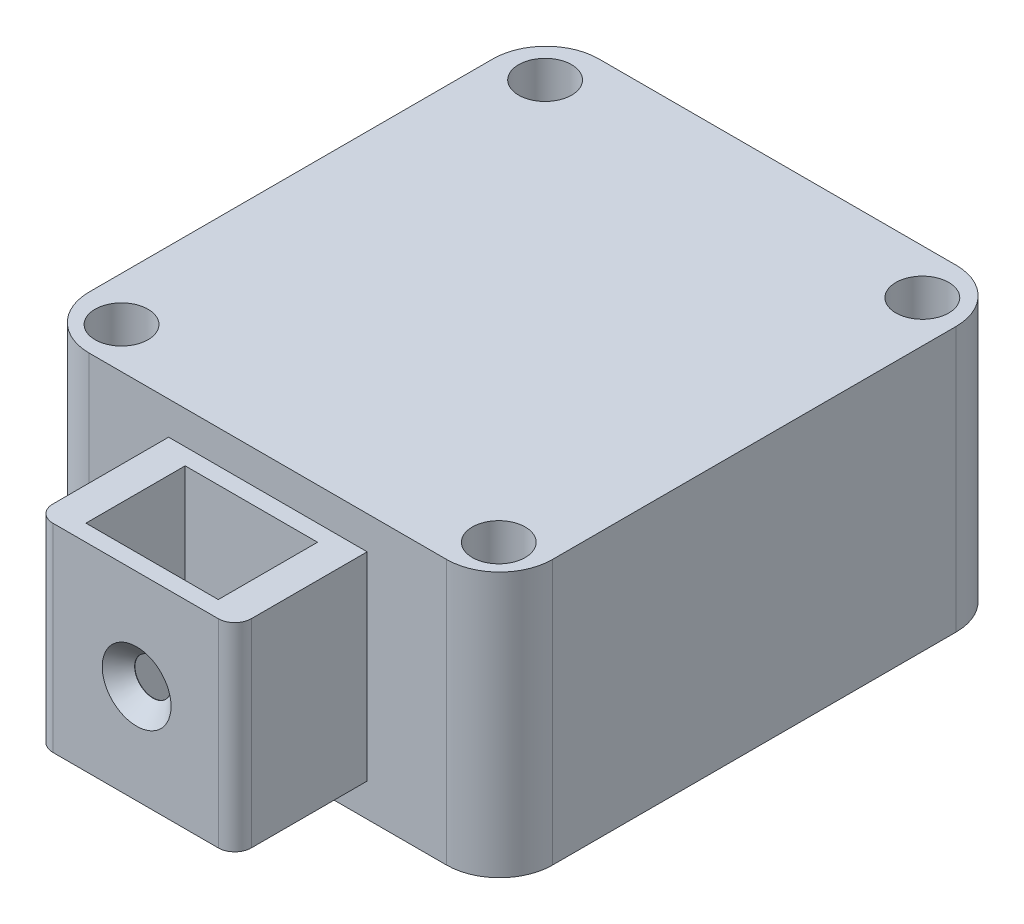
ISO-10303-21;
HEADER;
FILE_DESCRIPTION(('STEP AP214'),'2;1');
FILE_NAME('part.step','',(''),(''),'','','');
FILE_SCHEMA(('AUTOMOTIVE_DESIGN { 1 0 10303 214 1 1 1 1 }'));
ENDSEC;
DATA;
#1=APPLICATION_CONTEXT('core data for automotive mechanical design processes');
#2=APPLICATION_PROTOCOL_DEFINITION('international standard','automotive_design',2000,#1);
#3=PRODUCT_CONTEXT('',#1,'mechanical');
#4=PRODUCT('Part','Part','',(#3));
#5=PRODUCT_RELATED_PRODUCT_CATEGORY('part','',(#4));
#6=PRODUCT_DEFINITION_FORMATION('','',#4);
#7=PRODUCT_DEFINITION_CONTEXT('part definition',#1,'design');
#8=PRODUCT_DEFINITION('design','',#6,#7);
#9=PRODUCT_DEFINITION_SHAPE('','',#8);
#10=(LENGTH_UNIT() NAMED_UNIT(*) SI_UNIT(.MILLI.,.METRE.));
#11=(NAMED_UNIT(*) PLANE_ANGLE_UNIT() SI_UNIT($,.RADIAN.));
#12=(NAMED_UNIT(*) SI_UNIT($,.STERADIAN.) SOLID_ANGLE_UNIT());
#13=UNCERTAINTY_MEASURE_WITH_UNIT(LENGTH_MEASURE(1.E-05),#10,'distance_accuracy_value','');
#14=(GEOMETRIC_REPRESENTATION_CONTEXT(3) GLOBAL_UNCERTAINTY_ASSIGNED_CONTEXT((#13)) GLOBAL_UNIT_ASSIGNED_CONTEXT((#10,
#11,#12)) REPRESENTATION_CONTEXT('',''));
#15=CARTESIAN_POINT('',(0.,0.,0.));
#16=DIRECTION('',(0.,0.,1.));
#17=DIRECTION('',(1.,0.,0.));
#18=AXIS2_PLACEMENT_3D('',#15,#16,#17);
#19=CARTESIAN_POINT('',(-35.1933701657459,40.,38.1906077348066));
#20=DIRECTION('',(0.,0.,-1.));
#21=DIRECTION('',(-1.,0.,0.));
#22=AXIS2_PLACEMENT_3D('',#19,#20,#21);
#23=PLANE('',#22);
#24=DIRECTION('',(1.,0.,0.));
#25=VECTOR('',#24,1.);
#26=CARTESIAN_POINT('',(-35.1933701657459,0.,38.1906077348066));
#27=LINE('',#26,#25);
#28=CARTESIAN_POINT('',(-27.1933701657459,0.,38.1906077348066));
#29=VERTEX_POINT('',#28);
#30=CARTESIAN_POINT('',(26.8066298342541,0.,38.1906077348066));
#31=VERTEX_POINT('',#30);
#32=EDGE_CURVE('E268',#29,#31,#27,.T.);
#33=ORIENTED_EDGE('',*,*,#32,.T.);
#34=DIRECTION('',(0.,-1.,0.));
#35=VECTOR('',#34,1.);
#36=CARTESIAN_POINT('',(26.8066298342541,40.,38.1906077348066));
#37=LINE('',#36,#35);
#38=CARTESIAN_POINT('',(26.8066298342541,40.,38.1906077348066));
#39=VERTEX_POINT('',#38);
#40=EDGE_CURVE('E303',#31,#39,#37,.F.);
#41=ORIENTED_EDGE('',*,*,#40,.T.);
#42=DIRECTION('',(1.,0.,0.));
#43=VECTOR('',#42,1.);
#44=CARTESIAN_POINT('',(-35.1933701657459,40.,38.1906077348066));
#45=LINE('',#44,#43);
#46=CARTESIAN_POINT('',(-27.1933701657459,40.,38.1906077348066));
#47=VERTEX_POINT('',#46);
#48=EDGE_CURVE('E274',#47,#39,#45,.T.);
#49=ORIENTED_EDGE('',*,*,#48,.F.);
#50=DIRECTION('',(0.,-1.,0.));
#51=VECTOR('',#50,1.);
#52=CARTESIAN_POINT('',(-27.1933701657459,40.,38.1906077348066));
#53=LINE('',#52,#51);
#54=EDGE_CURVE('E300',#47,#29,#53,.T.);
#55=ORIENTED_EDGE('',*,*,#54,.T.);
#56=EDGE_LOOP('',(#33,#41,#49,#55));
#57=FACE_BOUND('',#56,.T.);
#58=DIRECTION('',(0.,-1.,0.));
#59=VECTOR('',#58,1.);
#60=CARTESIAN_POINT('',(-15.1933701657459,35.,38.1906077348066));
#61=LINE('',#60,#59);
#62=CARTESIAN_POINT('',(-15.1933701657459,35.,38.1906077348066));
#63=VERTEX_POINT('',#62);
#64=CARTESIAN_POINT('',(-15.1933701657459,5.,38.1906077348066));
#65=VERTEX_POINT('',#64);
#66=EDGE_CURVE('E207',#63,#65,#61,.T.);
#67=ORIENTED_EDGE('',*,*,#66,.F.);
#68=DIRECTION('',(-1.,0.,0.));
#69=VECTOR('',#68,1.);
#70=CARTESIAN_POINT('',(-15.1933701657459,35.,38.1906077348066));
#71=LINE('',#70,#69);
#72=CARTESIAN_POINT('',(14.8066298342541,35.,38.1906077348066));
#73=VERTEX_POINT('',#72);
#74=EDGE_CURVE('E218',#73,#63,#71,.T.);
#75=ORIENTED_EDGE('',*,*,#74,.F.);
#76=DIRECTION('',(0.,1.,0.));
#77=VECTOR('',#76,1.);
#78=CARTESIAN_POINT('',(14.8066298342541,35.,38.1906077348066));
#79=LINE('',#78,#77);
#80=CARTESIAN_POINT('',(14.8066298342541,5.,38.1906077348066));
#81=VERTEX_POINT('',#80);
#82=EDGE_CURVE('E227',#81,#73,#79,.T.);
#83=ORIENTED_EDGE('',*,*,#82,.F.);
#84=DIRECTION('',(1.,0.,0.));
#85=VECTOR('',#84,1.);
#86=CARTESIAN_POINT('',(-15.1933701657459,5.,38.1906077348066));
#87=LINE('',#86,#85);
#88=EDGE_CURVE('E224',#65,#81,#87,.T.);
#89=ORIENTED_EDGE('',*,*,#88,.F.);
#90=EDGE_LOOP('',(#67,#75,#83,#89));
#91=FACE_BOUND('',#90,.T.);
#92=ADVANCED_FACE('F32',(#57,#91),#23,.F.);
#93=CARTESIAN_POINT('',(34.8066298342541,40.,-38.8093922651934));
#94=DIRECTION('',(-1.,0.,0.));
#95=DIRECTION('',(0.,0.,1.));
#96=AXIS2_PLACEMENT_3D('',#93,#94,#95);
#97=PLANE('',#96);
#98=DIRECTION('',(0.,0.,-1.));
#99=VECTOR('',#98,1.);
#100=CARTESIAN_POINT('',(34.8066298342541,40.,-38.8093922651934));
#101=LINE('',#100,#99);
#102=CARTESIAN_POINT('',(34.8066298342541,40.,30.1906077348066));
#103=VERTEX_POINT('',#102);
#104=CARTESIAN_POINT('',(34.8066298342541,40.,-30.8093922651934));
#105=VERTEX_POINT('',#104);
#106=EDGE_CURVE('E264',#103,#105,#101,.T.);
#107=ORIENTED_EDGE('',*,*,#106,.F.);
#108=DIRECTION('',(0.,-1.,0.));
#109=VECTOR('',#108,1.);
#110=CARTESIAN_POINT('',(34.8066298342541,40.,30.1906077348066));
#111=LINE('',#110,#109);
#112=CARTESIAN_POINT('',(34.8066298342541,0.,30.1906077348066));
#113=VERTEX_POINT('',#112);
#114=EDGE_CURVE('E289',#103,#113,#111,.T.);
#115=ORIENTED_EDGE('',*,*,#114,.T.);
#116=DIRECTION('',(0.,0.,-1.));
#117=VECTOR('',#116,1.);
#118=CARTESIAN_POINT('',(34.8066298342541,0.,-38.8093922651934));
#119=LINE('',#118,#117);
#120=CARTESIAN_POINT('',(34.8066298342541,0.,-30.8093922651934));
#121=VERTEX_POINT('',#120);
#122=EDGE_CURVE('E261',#113,#121,#119,.T.);
#123=ORIENTED_EDGE('',*,*,#122,.T.);
#124=DIRECTION('',(0.,-1.,0.));
#125=VECTOR('',#124,1.);
#126=CARTESIAN_POINT('',(34.8066298342541,40.,-30.8093922651934));
#127=LINE('',#126,#125);
#128=EDGE_CURVE('E277',#121,#105,#127,.F.);
#129=ORIENTED_EDGE('',*,*,#128,.T.);
#130=EDGE_LOOP('',(#107,#115,#123,#129));
#131=FACE_BOUND('',#130,.T.);
#132=ADVANCED_FACE('F363',(#131),#97,.F.);
#133=CARTESIAN_POINT('',(-35.1933701657459,40.,-38.8093922651934));
#134=DIRECTION('',(0.,0.,1.));
#135=DIRECTION('',(1.,0.,0.));
#136=AXIS2_PLACEMENT_3D('',#133,#134,#135);
#137=PLANE('',#136);
#138=DIRECTION('',(-1.,0.,0.));
#139=VECTOR('',#138,1.);
#140=CARTESIAN_POINT('',(-35.1933701657459,40.,-38.8093922651934));
#141=LINE('',#140,#139);
#142=CARTESIAN_POINT('',(26.8066298342541,40.,-38.8093922651934));
#143=VERTEX_POINT('',#142);
#144=CARTESIAN_POINT('',(-27.1933701657459,40.,-38.8093922651934));
#145=VERTEX_POINT('',#144);
#146=EDGE_CURVE('E267',#143,#145,#141,.T.);
#147=ORIENTED_EDGE('',*,*,#146,.F.);
#148=DIRECTION('',(0.,-1.,0.));
#149=VECTOR('',#148,1.);
#150=CARTESIAN_POINT('',(26.8066298342541,40.,-38.8093922651934));
#151=LINE('',#150,#149);
#152=CARTESIAN_POINT('',(26.8066298342541,0.,-38.8093922651934));
#153=VERTEX_POINT('',#152);
#154=EDGE_CURVE('E315',#143,#153,#151,.T.);
#155=ORIENTED_EDGE('',*,*,#154,.T.);
#156=DIRECTION('',(-1.,0.,0.));
#157=VECTOR('',#156,1.);
#158=CARTESIAN_POINT('',(-35.1933701657459,0.,-38.8093922651934));
#159=LINE('',#158,#157);
#160=CARTESIAN_POINT('',(-27.1933701657459,0.,-38.8093922651934));
#161=VERTEX_POINT('',#160);
#162=EDGE_CURVE('E280',#153,#161,#159,.T.);
#163=ORIENTED_EDGE('',*,*,#162,.T.);
#164=DIRECTION('',(0.,-1.,0.));
#165=VECTOR('',#164,1.);
#166=CARTESIAN_POINT('',(-27.1933701657459,40.,-38.8093922651934));
#167=LINE('',#166,#165);
#168=EDGE_CURVE('E313',#161,#145,#167,.F.);
#169=ORIENTED_EDGE('',*,*,#168,.T.);
#170=EDGE_LOOP('',(#147,#155,#163,#169));
#171=FACE_BOUND('',#170,.T.);
#172=ADVANCED_FACE('F369',(#171),#137,.F.);
#173=CARTESIAN_POINT('',(-35.1933701657459,40.,-38.8093922651934));
#174=DIRECTION('',(1.,0.,0.));
#175=DIRECTION('',(0.,0.,-1.));
#176=AXIS2_PLACEMENT_3D('',#173,#174,#175);
#177=PLANE('',#176);
#178=DIRECTION('',(0.,0.,1.));
#179=VECTOR('',#178,1.);
#180=CARTESIAN_POINT('',(-35.1933701657459,40.,-38.8093922651934));
#181=LINE('',#180,#179);
#182=CARTESIAN_POINT('',(-35.1933701657459,40.,-30.8093922651934));
#183=VERTEX_POINT('',#182);
#184=CARTESIAN_POINT('',(-35.1933701657459,40.,30.1906077348066));
#185=VERTEX_POINT('',#184);
#186=EDGE_CURVE('E271',#183,#185,#181,.T.);
#187=ORIENTED_EDGE('',*,*,#186,.F.);
#188=DIRECTION('',(0.,-1.,0.));
#189=VECTOR('',#188,1.);
#190=CARTESIAN_POINT('',(-35.1933701657459,40.,-30.8093922651934));
#191=LINE('',#190,#189);
#192=CARTESIAN_POINT('',(-35.1933701657459,0.,-30.8093922651934));
#193=VERTEX_POINT('',#192);
#194=EDGE_CURVE('E320',#183,#193,#191,.T.);
#195=ORIENTED_EDGE('',*,*,#194,.T.);
#196=DIRECTION('',(0.,0.,1.));
#197=VECTOR('',#196,1.);
#198=CARTESIAN_POINT('',(-35.1933701657459,0.,-38.8093922651934));
#199=LINE('',#198,#197);
#200=CARTESIAN_POINT('',(-35.1933701657459,0.,30.1906077348066));
#201=VERTEX_POINT('',#200);
#202=EDGE_CURVE('E283',#193,#201,#199,.T.);
#203=ORIENTED_EDGE('',*,*,#202,.T.);
#204=DIRECTION('',(0.,-1.,0.));
#205=VECTOR('',#204,1.);
#206=CARTESIAN_POINT('',(-35.1933701657459,40.,30.1906077348066));
#207=LINE('',#206,#205);
#208=EDGE_CURVE('E318',#201,#185,#207,.F.);
#209=ORIENTED_EDGE('',*,*,#208,.T.);
#210=EDGE_LOOP('',(#187,#195,#203,#209));
#211=FACE_BOUND('',#210,.T.);
#212=ADVANCED_FACE('F376',(#211),#177,.F.);
#213=CARTESIAN_POINT('',(0.,40.,0.));
#214=DIRECTION('',(0.,1.,0.));
#215=DIRECTION('',(0.,0.,1.));
#216=AXIS2_PLACEMENT_3D('',#213,#214,#215);
#217=PLANE('',#216);
#218=CARTESIAN_POINT('',(-28.5,40.,-32.));
#219=DIRECTION('',(0.,1.,0.));
#220=DIRECTION('',(0.,0.,1.));
#221=AXIS2_PLACEMENT_3D('',#218,#219,#220);
#222=CIRCLE('',#221,4.);
#223=CARTESIAN_POINT('',(-28.5,40.,-28.));
#224=VERTEX_POINT('',#223);
#225=EDGE_CURVE('E239',#224,#224,#222,.T.);
#226=ORIENTED_EDGE('',*,*,#225,.F.);
#227=EDGE_LOOP('',(#226));
#228=FACE_BOUND('',#227,.T.);
#229=CARTESIAN_POINT('',(28.5,40.,-32.));
#230=DIRECTION('',(0.,1.,0.));
#231=DIRECTION('',(0.,0.,1.));
#232=AXIS2_PLACEMENT_3D('',#229,#230,#231);
#233=CIRCLE('',#232,4.00000000000001);
#234=CARTESIAN_POINT('',(28.5,40.,-28.));
#235=VERTEX_POINT('',#234);
#236=EDGE_CURVE('E250',#235,#235,#233,.T.);
#237=ORIENTED_EDGE('',*,*,#236,.F.);
#238=EDGE_LOOP('',(#237));
#239=FACE_BOUND('',#238,.T.);
#240=CARTESIAN_POINT('',(28.5,40.,32.));
#241=DIRECTION('',(0.,1.,0.));
#242=DIRECTION('',(0.,0.,1.));
#243=AXIS2_PLACEMENT_3D('',#240,#241,#242);
#244=CIRCLE('',#243,4.);
#245=CARTESIAN_POINT('',(28.5,40.,36.));
#246=VERTEX_POINT('',#245);
#247=EDGE_CURVE('E244',#246,#246,#244,.T.);
#248=ORIENTED_EDGE('',*,*,#247,.F.);
#249=EDGE_LOOP('',(#248));
#250=FACE_BOUND('',#249,.T.);
#251=CARTESIAN_POINT('',(-28.5,40.,32.));
#252=DIRECTION('',(0.,1.,0.));
#253=DIRECTION('',(0.,0.,1.));
#254=AXIS2_PLACEMENT_3D('',#251,#252,#253);
#255=CIRCLE('',#254,4.00000000000001);
#256=CARTESIAN_POINT('',(-28.5,40.,36.));
#257=VERTEX_POINT('',#256);
#258=EDGE_CURVE('E243',#257,#257,#255,.T.);
#259=ORIENTED_EDGE('',*,*,#258,.F.);
#260=EDGE_LOOP('',(#259));
#261=FACE_BOUND('',#260,.T.);
#262=ORIENTED_EDGE('',*,*,#48,.T.);
#263=CARTESIAN_POINT('',(26.8066298342541,40.,30.1906077348066));
#264=DIRECTION('',(0.,1.,0.));
#265=DIRECTION('',(0.,0.,1.));
#266=AXIS2_PLACEMENT_3D('',#263,#264,#265);
#267=CIRCLE('',#266,8.);
#268=EDGE_CURVE('E311',#39,#103,#267,.T.);
#269=ORIENTED_EDGE('',*,*,#268,.T.);
#270=ORIENTED_EDGE('',*,*,#106,.T.);
#271=CARTESIAN_POINT('',(26.8066298342541,40.,-30.8093922651934));
#272=DIRECTION('',(0.,1.,0.));
#273=DIRECTION('',(0.,0.,1.));
#274=AXIS2_PLACEMENT_3D('',#271,#272,#273);
#275=CIRCLE('',#274,8.);
#276=EDGE_CURVE('E309',#105,#143,#275,.T.);
#277=ORIENTED_EDGE('',*,*,#276,.T.);
#278=ORIENTED_EDGE('',*,*,#146,.T.);
#279=CARTESIAN_POINT('',(-27.1933701657459,40.,-30.8093922651934));
#280=DIRECTION('',(0.,1.,0.));
#281=DIRECTION('',(0.,0.,1.));
#282=AXIS2_PLACEMENT_3D('',#279,#280,#281);
#283=CIRCLE('',#282,8.);
#284=EDGE_CURVE('E307',#145,#183,#283,.T.);
#285=ORIENTED_EDGE('',*,*,#284,.T.);
#286=ORIENTED_EDGE('',*,*,#186,.T.);
#287=CARTESIAN_POINT('',(-27.1933701657459,40.,30.1906077348066));
#288=DIRECTION('',(0.,1.,0.));
#289=DIRECTION('',(0.,0.,1.));
#290=AXIS2_PLACEMENT_3D('',#287,#288,#289);
#291=CIRCLE('',#290,8.);
#292=EDGE_CURVE('E305',#185,#47,#291,.T.);
#293=ORIENTED_EDGE('',*,*,#292,.T.);
#294=EDGE_LOOP('',(#262,#269,#270,#277,#278,#285,#286,#293));
#295=FACE_BOUND('',#294,.T.);
#296=ADVANCED_FACE('F379',(#228,#239,#250,#261,#295),#217,.T.);
#297=CARTESIAN_POINT('',(0.,0.,0.));
#298=DIRECTION('',(0.,1.,0.));
#299=DIRECTION('',(0.,0.,1.));
#300=AXIS2_PLACEMENT_3D('',#297,#298,#299);
#301=PLANE('',#300);
#302=ORIENTED_EDGE('',*,*,#122,.F.);
#303=CARTESIAN_POINT('',(26.8066298342541,0.,30.1906077348066));
#304=DIRECTION('',(0.,1.,0.));
#305=DIRECTION('',(0.,0.,1.));
#306=AXIS2_PLACEMENT_3D('',#303,#304,#305);
#307=CIRCLE('',#306,8.);
#308=EDGE_CURVE('E298',#113,#31,#307,.F.);
#309=ORIENTED_EDGE('',*,*,#308,.T.);
#310=ORIENTED_EDGE('',*,*,#32,.F.);
#311=CARTESIAN_POINT('',(-27.1933701657459,0.,30.1906077348066));
#312=DIRECTION('',(0.,1.,0.));
#313=DIRECTION('',(0.,0.,1.));
#314=AXIS2_PLACEMENT_3D('',#311,#312,#313);
#315=CIRCLE('',#314,8.);
#316=EDGE_CURVE('E292',#29,#201,#315,.F.);
#317=ORIENTED_EDGE('',*,*,#316,.T.);
#318=ORIENTED_EDGE('',*,*,#202,.F.);
#319=CARTESIAN_POINT('',(-27.1933701657459,0.,-30.8093922651934));
#320=DIRECTION('',(0.,1.,0.));
#321=DIRECTION('',(0.,0.,1.));
#322=AXIS2_PLACEMENT_3D('',#319,#320,#321);
#323=CIRCLE('',#322,8.);
#324=EDGE_CURVE('E294',#193,#161,#323,.F.);
#325=ORIENTED_EDGE('',*,*,#324,.T.);
#326=ORIENTED_EDGE('',*,*,#162,.F.);
#327=CARTESIAN_POINT('',(26.8066298342541,0.,-30.8093922651934));
#328=DIRECTION('',(0.,1.,0.));
#329=DIRECTION('',(0.,0.,1.));
#330=AXIS2_PLACEMENT_3D('',#327,#328,#329);
#331=CIRCLE('',#330,8.);
#332=EDGE_CURVE('E296',#153,#121,#331,.F.);
#333=ORIENTED_EDGE('',*,*,#332,.T.);
#334=EDGE_LOOP('',(#302,#309,#310,#317,#318,#325,#326,#333));
#335=FACE_BOUND('',#334,.T.);
#336=ADVANCED_FACE('F374',(#335),#301,.F.);
#337=CARTESIAN_POINT('',(-28.5,10.,32.));
#338=DIRECTION('',(0.,1.,0.));
#339=DIRECTION('',(0.,0.,1.));
#340=AXIS2_PLACEMENT_3D('',#337,#338,#339);
#341=CYLINDRICAL_SURFACE('',#340,4.00000000000001);
#342=CARTESIAN_POINT('',(-28.5,10.,32.));
#343=DIRECTION('',(0.,1.,0.));
#344=DIRECTION('',(0.,0.,1.));
#345=AXIS2_PLACEMENT_3D('',#342,#343,#344);
#346=CIRCLE('',#345,4.00000000000001);
#347=CARTESIAN_POINT('',(-28.5,10.,36.));
#348=VERTEX_POINT('',#347);
#349=EDGE_CURVE('E258',#348,#348,#346,.T.);
#350=ORIENTED_EDGE('',*,*,#349,.F.);
#351=EDGE_LOOP('',(#350));
#352=FACE_BOUND('',#351,.T.);
#353=ORIENTED_EDGE('',*,*,#258,.T.);
#354=EDGE_LOOP('',(#353));
#355=FACE_BOUND('',#354,.T.);
#356=ADVANCED_FACE('F422',(#352,#355),#341,.F.);
#357=CARTESIAN_POINT('',(0.,10.,0.));
#358=DIRECTION('',(0.,1.,0.));
#359=DIRECTION('',(0.,0.,1.));
#360=AXIS2_PLACEMENT_3D('',#357,#358,#359);
#361=PLANE('',#360);
#362=ORIENTED_EDGE('',*,*,#349,.T.);
#363=EDGE_LOOP('',(#362));
#364=FACE_BOUND('',#363,.T.);
#365=ADVANCED_FACE('F427',(#364),#361,.T.);
#366=CARTESIAN_POINT('',(28.5,10.,32.));
#367=DIRECTION('',(0.,1.,0.));
#368=DIRECTION('',(0.,0.,1.));
#369=AXIS2_PLACEMENT_3D('',#366,#367,#368);
#370=CYLINDRICAL_SURFACE('',#369,4.);
#371=CARTESIAN_POINT('',(28.5,10.,32.));
#372=DIRECTION('',(0.,1.,0.));
#373=DIRECTION('',(0.,0.,1.));
#374=AXIS2_PLACEMENT_3D('',#371,#372,#373);
#375=CIRCLE('',#374,4.);
#376=CARTESIAN_POINT('',(28.5,10.,36.));
#377=VERTEX_POINT('',#376);
#378=EDGE_CURVE('E240',#377,#377,#375,.T.);
#379=ORIENTED_EDGE('',*,*,#378,.F.);
#380=EDGE_LOOP('',(#379));
#381=FACE_BOUND('',#380,.T.);
#382=ORIENTED_EDGE('',*,*,#247,.T.);
#383=EDGE_LOOP('',(#382));
#384=FACE_BOUND('',#383,.T.);
#385=ADVANCED_FACE('F438',(#381,#384),#370,.F.);
#386=CARTESIAN_POINT('',(0.,10.,0.));
#387=DIRECTION('',(0.,1.,0.));
#388=DIRECTION('',(0.,0.,1.));
#389=AXIS2_PLACEMENT_3D('',#386,#387,#388);
#390=PLANE('',#389);
#391=ORIENTED_EDGE('',*,*,#378,.T.);
#392=EDGE_LOOP('',(#391));
#393=FACE_BOUND('',#392,.T.);
#394=ADVANCED_FACE('F452',(#393),#390,.T.);
#395=CARTESIAN_POINT('',(28.5,10.,-32.));
#396=DIRECTION('',(0.,1.,0.));
#397=DIRECTION('',(0.,0.,1.));
#398=AXIS2_PLACEMENT_3D('',#395,#396,#397);
#399=CYLINDRICAL_SURFACE('',#398,4.00000000000001);
#400=CARTESIAN_POINT('',(28.5,10.,-32.));
#401=DIRECTION('',(0.,1.,0.));
#402=DIRECTION('',(0.,0.,1.));
#403=AXIS2_PLACEMENT_3D('',#400,#401,#402);
#404=CIRCLE('',#403,4.00000000000001);
#405=CARTESIAN_POINT('',(28.5,10.,-28.));
#406=VERTEX_POINT('',#405);
#407=EDGE_CURVE('E247',#406,#406,#404,.T.);
#408=ORIENTED_EDGE('',*,*,#407,.F.);
#409=EDGE_LOOP('',(#408));
#410=FACE_BOUND('',#409,.T.);
#411=ORIENTED_EDGE('',*,*,#236,.T.);
#412=EDGE_LOOP('',(#411));
#413=FACE_BOUND('',#412,.T.);
#414=ADVANCED_FACE('F449',(#410,#413),#399,.F.);
#415=CARTESIAN_POINT('',(0.,10.,0.));
#416=DIRECTION('',(0.,1.,0.));
#417=DIRECTION('',(0.,0.,1.));
#418=AXIS2_PLACEMENT_3D('',#415,#416,#417);
#419=PLANE('',#418);
#420=ORIENTED_EDGE('',*,*,#407,.T.);
#421=EDGE_LOOP('',(#420));
#422=FACE_BOUND('',#421,.T.);
#423=ADVANCED_FACE('F444',(#422),#419,.T.);
#424=CARTESIAN_POINT('',(-28.5,10.,-32.));
#425=DIRECTION('',(0.,1.,0.));
#426=DIRECTION('',(0.,0.,1.));
#427=AXIS2_PLACEMENT_3D('',#424,#425,#426);
#428=CYLINDRICAL_SURFACE('',#427,4.);
#429=CARTESIAN_POINT('',(-28.5,10.,-32.));
#430=DIRECTION('',(0.,1.,0.));
#431=DIRECTION('',(0.,0.,1.));
#432=AXIS2_PLACEMENT_3D('',#429,#430,#431);
#433=CIRCLE('',#432,4.);
#434=CARTESIAN_POINT('',(-28.5,10.,-28.));
#435=VERTEX_POINT('',#434);
#436=EDGE_CURVE('E253',#435,#435,#433,.T.);
#437=ORIENTED_EDGE('',*,*,#436,.F.);
#438=EDGE_LOOP('',(#437));
#439=FACE_BOUND('',#438,.T.);
#440=ORIENTED_EDGE('',*,*,#225,.T.);
#441=EDGE_LOOP('',(#440));
#442=FACE_BOUND('',#441,.T.);
#443=ADVANCED_FACE('F440',(#439,#442),#428,.F.);
#444=CARTESIAN_POINT('',(0.,10.,0.));
#445=DIRECTION('',(0.,1.,0.));
#446=DIRECTION('',(0.,0.,1.));
#447=AXIS2_PLACEMENT_3D('',#444,#445,#446);
#448=PLANE('',#447);
#449=ORIENTED_EDGE('',*,*,#436,.T.);
#450=EDGE_LOOP('',(#449));
#451=FACE_BOUND('',#450,.T.);
#452=ADVANCED_FACE('F443',(#451),#448,.T.);
#453=CARTESIAN_POINT('',(-15.1933701657459,35.,58.1906077348066));
#454=DIRECTION('',(1.,0.,0.));
#455=DIRECTION('',(0.,1.,0.));
#456=AXIS2_PLACEMENT_3D('',#453,#454,#455);
#457=PLANE('',#456);
#458=DIRECTION('',(0.,0.,-1.));
#459=VECTOR('',#458,1.);
#460=CARTESIAN_POINT('',(-15.1933701657459,5.,58.1906077348066));
#461=LINE('',#460,#459);
#462=CARTESIAN_POINT('',(-15.1933701657459,5.,55.6906077348066));
#463=VERTEX_POINT('',#462);
#464=EDGE_CURVE('E237',#463,#65,#461,.T.);
#465=ORIENTED_EDGE('',*,*,#464,.F.);
#466=DIRECTION('',(0.,-1.,0.));
#467=VECTOR('',#466,1.);
#468=CARTESIAN_POINT('',(-15.1933701657459,35.,55.6906077348066));
#469=LINE('',#468,#467);
#470=CARTESIAN_POINT('',(-15.1933701657459,35.,55.6906077348066));
#471=VERTEX_POINT('',#470);
#472=EDGE_CURVE('E11',#463,#471,#469,.F.);
#473=ORIENTED_EDGE('',*,*,#472,.T.);
#474=DIRECTION('',(0.,0.,-1.));
#475=VECTOR('',#474,1.);
#476=CARTESIAN_POINT('',(-15.1933701657459,35.,58.1906077348066));
#477=LINE('',#476,#475);
#478=EDGE_CURVE('E221',#471,#63,#477,.T.);
#479=ORIENTED_EDGE('',*,*,#478,.T.);
#480=ORIENTED_EDGE('',*,*,#66,.T.);
#481=EDGE_LOOP('',(#465,#473,#479,#480));
#482=FACE_BOUND('',#481,.T.);
#483=ADVANCED_FACE('F353',(#482),#457,.F.);
#484=CARTESIAN_POINT('',(-15.1933701657459,5.,58.1906077348066));
#485=DIRECTION('',(0.,1.,0.));
#486=DIRECTION('',(0.,0.,1.));
#487=AXIS2_PLACEMENT_3D('',#484,#485,#486);
#488=PLANE('',#487);
#489=DIRECTION('',(-1.,0.,0.));
#490=VECTOR('',#489,1.);
#491=CARTESIAN_POINT('',(-10.1933701657459,5.,40.6906077348066));
#492=LINE('',#491,#490);
#493=CARTESIAN_POINT('',(9.80662983425414,5.,40.6906077348066));
#494=VERTEX_POINT('',#493);
#495=CARTESIAN_POINT('',(-10.1933701657459,5.,40.6906077348066));
#496=VERTEX_POINT('',#495);
#497=EDGE_CURVE('E192',#494,#496,#492,.T.);
#498=ORIENTED_EDGE('',*,*,#497,.T.);
#499=DIRECTION('',(0.,0.,1.));
#500=VECTOR('',#499,1.);
#501=CARTESIAN_POINT('',(-10.1933701657459,5.,40.6906077348066));
#502=LINE('',#501,#500);
#503=CARTESIAN_POINT('',(-10.1933701657459,5.,55.6906077348066));
#504=VERTEX_POINT('',#503);
#505=EDGE_CURVE('E182',#496,#504,#502,.T.);
#506=ORIENTED_EDGE('',*,*,#505,.T.);
#507=DIRECTION('',(1.,0.,0.));
#508=VECTOR('',#507,1.);
#509=CARTESIAN_POINT('',(-10.1933701657459,5.,55.6906077348066));
#510=LINE('',#509,#508);
#511=CARTESIAN_POINT('',(9.80662983425413,5.,55.6906077348066));
#512=VERTEX_POINT('',#511);
#513=EDGE_CURVE('E185',#504,#512,#510,.T.);
#514=ORIENTED_EDGE('',*,*,#513,.T.);
#515=DIRECTION('',(0.,0.,-1.));
#516=VECTOR('',#515,1.);
#517=CARTESIAN_POINT('',(9.80662983425414,5.,40.6906077348066));
#518=LINE('',#517,#516);
#519=EDGE_CURVE('E189',#512,#494,#518,.T.);
#520=ORIENTED_EDGE('',*,*,#519,.T.);
#521=EDGE_LOOP('',(#498,#506,#514,#520));
#522=FACE_BOUND('',#521,.T.);
#523=DIRECTION('',(0.,0.,-1.));
#524=VECTOR('',#523,1.);
#525=CARTESIAN_POINT('',(14.8066298342541,5.,58.1906077348066));
#526=LINE('',#525,#524);
#527=CARTESIAN_POINT('',(14.8066298342541,5.,55.6906077348066));
#528=VERTEX_POINT('',#527);
#529=EDGE_CURVE('E235',#528,#81,#526,.T.);
#530=ORIENTED_EDGE('',*,*,#529,.F.);
#531=CARTESIAN_POINT('',(12.3066298342541,5.,55.6906077348066));
#532=DIRECTION('',(0.,1.,0.));
#533=DIRECTION('',(0.,0.,1.));
#534=AXIS2_PLACEMENT_3D('',#531,#532,#533);
#535=CIRCLE('',#534,2.5);
#536=CARTESIAN_POINT('',(12.3066298342541,5.,58.1906077348066));
#537=VERTEX_POINT('',#536);
#538=EDGE_CURVE('E40',#528,#537,#535,.F.);
#539=ORIENTED_EDGE('',*,*,#538,.T.);
#540=DIRECTION('',(1.,0.,0.));
#541=VECTOR('',#540,1.);
#542=CARTESIAN_POINT('',(-15.1933701657459,5.,58.1906077348066));
#543=LINE('',#542,#541);
#544=CARTESIAN_POINT('',(-12.6933701657459,5.,58.1906077348066));
#545=VERTEX_POINT('',#544);
#546=EDGE_CURVE('E214',#545,#537,#543,.T.);
#547=ORIENTED_EDGE('',*,*,#546,.F.);
#548=CARTESIAN_POINT('',(-12.6933701657459,5.,55.6906077348066));
#549=DIRECTION('',(0.,1.,0.));
#550=DIRECTION('',(0.,0.,1.));
#551=AXIS2_PLACEMENT_3D('',#548,#549,#550);
#552=CIRCLE('',#551,2.5);
#553=EDGE_CURVE('E47',#545,#463,#552,.F.);
#554=ORIENTED_EDGE('',*,*,#553,.T.);
#555=ORIENTED_EDGE('',*,*,#464,.T.);
#556=ORIENTED_EDGE('',*,*,#88,.T.);
#557=EDGE_LOOP('',(#530,#539,#547,#554,#555,#556));
#558=FACE_BOUND('',#557,.T.);
#559=ADVANCED_FACE('F335',(#522,#558),#488,.F.);
#560=CARTESIAN_POINT('',(14.8066298342541,35.,58.1906077348066));
#561=DIRECTION('',(-1.,0.,0.));
#562=DIRECTION('',(0.,-1.,0.));
#563=AXIS2_PLACEMENT_3D('',#560,#561,#562);
#564=PLANE('',#563);
#565=DIRECTION('',(0.,0.,-1.));
#566=VECTOR('',#565,1.);
#567=CARTESIAN_POINT('',(14.8066298342541,35.,58.1906077348066));
#568=LINE('',#567,#566);
#569=CARTESIAN_POINT('',(14.8066298342541,35.,55.6906077348066));
#570=VERTEX_POINT('',#569);
#571=EDGE_CURVE('E233',#570,#73,#568,.T.);
#572=ORIENTED_EDGE('',*,*,#571,.F.);
#573=DIRECTION('',(0.,1.,0.));
#574=VECTOR('',#573,1.);
#575=CARTESIAN_POINT('',(14.8066298342541,5.,55.6906077348066));
#576=LINE('',#575,#574);
#577=EDGE_CURVE('E55',#570,#528,#576,.F.);
#578=ORIENTED_EDGE('',*,*,#577,.T.);
#579=ORIENTED_EDGE('',*,*,#529,.T.);
#580=ORIENTED_EDGE('',*,*,#82,.T.);
#581=EDGE_LOOP('',(#572,#578,#579,#580));
#582=FACE_BOUND('',#581,.T.);
#583=ADVANCED_FACE('F346',(#582),#564,.F.);
#584=CARTESIAN_POINT('',(-15.1933701657459,35.,58.1906077348066));
#585=DIRECTION('',(0.,-1.,0.));
#586=DIRECTION('',(1.,0.,0.));
#587=AXIS2_PLACEMENT_3D('',#584,#585,#586);
#588=PLANE('',#587);
#589=DIRECTION('',(1.,0.,0.));
#590=VECTOR('',#589,1.);
#591=CARTESIAN_POINT('',(-10.1933701657459,35.,55.6906077348066));
#592=LINE('',#591,#590);
#593=CARTESIAN_POINT('',(-10.1933701657459,35.,55.6906077348066));
#594=VERTEX_POINT('',#593);
#595=CARTESIAN_POINT('',(9.80662983425413,35.,55.6906077348066));
#596=VERTEX_POINT('',#595);
#597=EDGE_CURVE('E197',#594,#596,#592,.T.);
#598=ORIENTED_EDGE('',*,*,#597,.F.);
#599=DIRECTION('',(0.,0.,1.));
#600=VECTOR('',#599,1.);
#601=CARTESIAN_POINT('',(-10.1933701657459,35.,40.6906077348066));
#602=LINE('',#601,#600);
#603=CARTESIAN_POINT('',(-10.1933701657459,35.,40.6906077348066));
#604=VERTEX_POINT('',#603);
#605=EDGE_CURVE('E181',#604,#594,#602,.T.);
#606=ORIENTED_EDGE('',*,*,#605,.F.);
#607=DIRECTION('',(-1.,0.,0.));
#608=VECTOR('',#607,1.);
#609=CARTESIAN_POINT('',(-10.1933701657459,35.,40.6906077348066));
#610=LINE('',#609,#608);
#611=CARTESIAN_POINT('',(9.80662983425414,35.,40.6906077348066));
#612=VERTEX_POINT('',#611);
#613=EDGE_CURVE('E186',#612,#604,#610,.T.);
#614=ORIENTED_EDGE('',*,*,#613,.F.);
#615=DIRECTION('',(0.,0.,-1.));
#616=VECTOR('',#615,1.);
#617=CARTESIAN_POINT('',(9.80662983425414,35.,40.6906077348066));
#618=LINE('',#617,#616);
#619=EDGE_CURVE('E200',#596,#612,#618,.T.);
#620=ORIENTED_EDGE('',*,*,#619,.F.);
#621=EDGE_LOOP('',(#598,#606,#614,#620));
#622=FACE_BOUND('',#621,.T.);
#623=DIRECTION('',(-1.,0.,0.));
#624=VECTOR('',#623,1.);
#625=CARTESIAN_POINT('',(-15.1933701657459,35.,58.1906077348066));
#626=LINE('',#625,#624);
#627=CARTESIAN_POINT('',(12.3066298342541,35.,58.1906077348066));
#628=VERTEX_POINT('',#627);
#629=CARTESIAN_POINT('',(-12.6933701657459,35.,58.1906077348066));
#630=VERTEX_POINT('',#629);
#631=EDGE_CURVE('E217',#628,#630,#626,.T.);
#632=ORIENTED_EDGE('',*,*,#631,.F.);
#633=CARTESIAN_POINT('',(12.3066298342541,35.,55.6906077348066));
#634=DIRECTION('',(0.,-1.,0.));
#635=DIRECTION('',(1.,0.,0.));
#636=AXIS2_PLACEMENT_3D('',#633,#634,#635);
#637=CIRCLE('',#636,2.5);
#638=EDGE_CURVE('E331',#628,#570,#637,.F.);
#639=ORIENTED_EDGE('',*,*,#638,.T.);
#640=ORIENTED_EDGE('',*,*,#571,.T.);
#641=ORIENTED_EDGE('',*,*,#74,.T.);
#642=ORIENTED_EDGE('',*,*,#478,.F.);
#643=CARTESIAN_POINT('',(-12.6933701657459,35.,55.6906077348066));
#644=DIRECTION('',(0.,-1.,0.));
#645=DIRECTION('',(1.,0.,0.));
#646=AXIS2_PLACEMENT_3D('',#643,#644,#645);
#647=CIRCLE('',#646,2.5);
#648=EDGE_CURVE('E329',#471,#630,#647,.F.);
#649=ORIENTED_EDGE('',*,*,#648,.T.);
#650=EDGE_LOOP('',(#632,#639,#640,#641,#642,#649));
#651=FACE_BOUND('',#650,.T.);
#652=ADVANCED_FACE('F344',(#622,#651),#588,.F.);
#653=CARTESIAN_POINT('',(0.,0.,58.1906077348066));
#654=DIRECTION('',(0.,0.,1.));
#655=DIRECTION('',(1.,0.,0.));
#656=AXIS2_PLACEMENT_3D('',#653,#654,#655);
#657=PLANE('',#656);
#658=CARTESIAN_POINT('',(-0.0287580169110735,19.9588469627916,58.1906077348066));
#659=DIRECTION('',(0.,0.,1.));
#660=DIRECTION('',(1.,0.,0.));
#661=AXIS2_PLACEMENT_3D('',#658,#659,#660);
#662=CIRCLE('',#661,5.2);
#663=CARTESIAN_POINT('',(5.17124198308893,19.9588469627916,58.1906077348066));
#664=VERTEX_POINT('',#663);
#665=EDGE_CURVE('E175',#664,#664,#662,.T.);
#666=ORIENTED_EDGE('',*,*,#665,.F.);
#667=EDGE_LOOP('',(#666));
#668=FACE_BOUND('',#667,.T.);
#669=ORIENTED_EDGE('',*,*,#546,.T.);
#670=DIRECTION('',(0.,1.,0.));
#671=VECTOR('',#670,1.);
#672=CARTESIAN_POINT('',(12.3066298342541,35.,58.1906077348066));
#673=LINE('',#672,#671);
#674=EDGE_CURVE('E326',#537,#628,#673,.T.);
#675=ORIENTED_EDGE('',*,*,#674,.T.);
#676=ORIENTED_EDGE('',*,*,#631,.T.);
#677=DIRECTION('',(0.,-1.,0.));
#678=VECTOR('',#677,1.);
#679=CARTESIAN_POINT('',(-12.6933701657459,5.,58.1906077348066));
#680=LINE('',#679,#678);
#681=EDGE_CURVE('E323',#630,#545,#680,.T.);
#682=ORIENTED_EDGE('',*,*,#681,.T.);
#683=EDGE_LOOP('',(#669,#675,#676,#682));
#684=FACE_BOUND('',#683,.T.);
#685=ADVANCED_FACE('F339',(#668,#684),#657,.T.);
#686=CARTESIAN_POINT('',(-10.1933701657459,5.,40.6906077348066));
#687=DIRECTION('',(-1.,0.,0.));
#688=DIRECTION('',(0.,0.,1.));
#689=AXIS2_PLACEMENT_3D('',#686,#687,#688);
#690=PLANE('',#689);
#691=ORIENTED_EDGE('',*,*,#605,.T.);
#692=DIRECTION('',(0.,1.,0.));
#693=VECTOR('',#692,1.);
#694=CARTESIAN_POINT('',(-10.1933701657459,5.,55.6906077348066));
#695=LINE('',#694,#693);
#696=EDGE_CURVE('E195',#504,#594,#695,.T.);
#697=ORIENTED_EDGE('',*,*,#696,.F.);
#698=ORIENTED_EDGE('',*,*,#505,.F.);
#699=DIRECTION('',(0.,1.,0.));
#700=VECTOR('',#699,1.);
#701=CARTESIAN_POINT('',(-10.1933701657459,5.,40.6906077348066));
#702=LINE('',#701,#700);
#703=EDGE_CURVE('E205',#496,#604,#702,.T.);
#704=ORIENTED_EDGE('',*,*,#703,.T.);
#705=EDGE_LOOP('',(#691,#697,#698,#704));
#706=FACE_BOUND('',#705,.T.);
#707=ADVANCED_FACE('F475',(#706),#690,.F.);
#708=CARTESIAN_POINT('',(-10.1933701657459,5.,40.6906077348066));
#709=DIRECTION('',(0.,0.,-1.));
#710=DIRECTION('',(-1.,0.,0.));
#711=AXIS2_PLACEMENT_3D('',#708,#709,#710);
#712=PLANE('',#711);
#713=CARTESIAN_POINT('',(-0.0287580169110735,19.9588469627916,40.6906077348066));
#714=DIRECTION('',(0.,0.,-1.));
#715=DIRECTION('',(-1.,0.,0.));
#716=AXIS2_PLACEMENT_3D('',#713,#714,#715);
#717=CIRCLE('',#716,2.74999999999999);
#718=CARTESIAN_POINT('',(-2.77875801691107,19.9588469627916,40.6906077348066));
#719=VERTEX_POINT('',#718);
#720=EDGE_CURVE('E172',#719,#719,#717,.T.);
#721=ORIENTED_EDGE('',*,*,#720,.T.);
#722=EDGE_LOOP('',(#721));
#723=FACE_BOUND('',#722,.T.);
#724=ORIENTED_EDGE('',*,*,#613,.T.);
#725=ORIENTED_EDGE('',*,*,#703,.F.);
#726=ORIENTED_EDGE('',*,*,#497,.F.);
#727=DIRECTION('',(0.,1.,0.));
#728=VECTOR('',#727,1.);
#729=CARTESIAN_POINT('',(9.80662983425414,5.,40.6906077348066));
#730=LINE('',#729,#728);
#731=EDGE_CURVE('E208',#494,#612,#730,.T.);
#732=ORIENTED_EDGE('',*,*,#731,.T.);
#733=EDGE_LOOP('',(#724,#725,#726,#732));
#734=FACE_BOUND('',#733,.T.);
#735=ADVANCED_FACE('F479',(#723,#734),#712,.F.);
#736=CARTESIAN_POINT('',(9.80662983425414,5.,40.6906077348066));
#737=DIRECTION('',(1.,0.,0.));
#738=DIRECTION('',(0.,0.,-1.));
#739=AXIS2_PLACEMENT_3D('',#736,#737,#738);
#740=PLANE('',#739);
#741=ORIENTED_EDGE('',*,*,#619,.T.);
#742=ORIENTED_EDGE('',*,*,#731,.F.);
#743=ORIENTED_EDGE('',*,*,#519,.F.);
#744=DIRECTION('',(0.,1.,0.));
#745=VECTOR('',#744,1.);
#746=CARTESIAN_POINT('',(9.80662983425413,5.,55.6906077348066));
#747=LINE('',#746,#745);
#748=EDGE_CURVE('E210',#512,#596,#747,.T.);
#749=ORIENTED_EDGE('',*,*,#748,.T.);
#750=EDGE_LOOP('',(#741,#742,#743,#749));
#751=FACE_BOUND('',#750,.T.);
#752=ADVANCED_FACE('F485',(#751),#740,.F.);
#753=CARTESIAN_POINT('',(-10.1933701657459,5.,55.6906077348066));
#754=DIRECTION('',(0.,0.,1.));
#755=DIRECTION('',(1.,0.,0.));
#756=AXIS2_PLACEMENT_3D('',#753,#754,#755);
#757=PLANE('',#756);
#758=CARTESIAN_POINT('',(-0.0287580169110735,19.9588469627916,55.6906077348066));
#759=DIRECTION('',(0.,0.,1.));
#760=DIRECTION('',(1.,0.,0.));
#761=AXIS2_PLACEMENT_3D('',#758,#759,#760);
#762=CIRCLE('',#761,2.74999999999999);
#763=CARTESIAN_POINT('',(2.72124198308892,19.9588469627916,55.6906077348066));
#764=VERTEX_POINT('',#763);
#765=EDGE_CURVE('E168',#764,#764,#762,.T.);
#766=ORIENTED_EDGE('',*,*,#765,.T.);
#767=EDGE_LOOP('',(#766));
#768=FACE_BOUND('',#767,.T.);
#769=ORIENTED_EDGE('',*,*,#597,.T.);
#770=ORIENTED_EDGE('',*,*,#748,.F.);
#771=ORIENTED_EDGE('',*,*,#513,.F.);
#772=ORIENTED_EDGE('',*,*,#696,.T.);
#773=EDGE_LOOP('',(#769,#770,#771,#772));
#774=FACE_BOUND('',#773,.T.);
#775=ADVANCED_FACE('F481',(#768,#774),#757,.F.);
#776=CARTESIAN_POINT('',(-0.0287580169110735,19.9588469627916,58.1906077348066));
#777=DIRECTION('',(0.,0.,1.));
#778=DIRECTION('',(1.,0.,0.));
#779=AXIS2_PLACEMENT_3D('',#776,#777,#778);
#780=CYLINDRICAL_SURFACE('',#779,2.74999999999999);
#781=CARTESIAN_POINT('',(-0.0287580169110735,19.9588469627916,55.7406077348066));
#782=DIRECTION('',(0.,0.,1.));
#783=DIRECTION('',(1.,0.,0.));
#784=AXIS2_PLACEMENT_3D('',#781,#782,#783);
#785=CIRCLE('',#784,2.74999999999999);
#786=CARTESIAN_POINT('',(2.72124198308892,19.9588469627916,55.7406077348066));
#787=VERTEX_POINT('',#786);
#788=EDGE_CURVE('E169',#787,#787,#785,.T.);
#789=ORIENTED_EDGE('',*,*,#788,.T.);
#790=EDGE_LOOP('',(#789));
#791=FACE_BOUND('',#790,.T.);
#792=ORIENTED_EDGE('',*,*,#765,.F.);
#793=EDGE_LOOP('',(#792));
#794=FACE_BOUND('',#793,.T.);
#795=ADVANCED_FACE('F484',(#791,#794),#780,.F.);
#796=CARTESIAN_POINT('',(-0.0287580169110735,19.9588469627916,58.1906077348066));
#797=DIRECTION('',(0.,0.,1.));
#798=DIRECTION('',(1.,0.,0.));
#799=AXIS2_PLACEMENT_3D('',#796,#797,#798);
#800=CONICAL_SURFACE('',#799,5.2,0.78539816339745);
#801=ORIENTED_EDGE('',*,*,#788,.F.);
#802=EDGE_LOOP('',(#801));
#803=FACE_BOUND('',#802,.T.);
#804=ORIENTED_EDGE('',*,*,#665,.T.);
#805=EDGE_LOOP('',(#804));
#806=FACE_BOUND('',#805,.T.);
#807=ADVANCED_FACE('F495',(#803,#806),#800,.F.);
#808=CARTESIAN_POINT('',(-0.0287580169110735,19.9588469627916,28.1906077348066));
#809=DIRECTION('',(0.,0.,1.));
#810=DIRECTION('',(1.,0.,0.));
#811=AXIS2_PLACEMENT_3D('',#808,#809,#810);
#812=CIRCLE('',#811,2.74999999999999);
#813=CARTESIAN_POINT('',(2.72124198308892,19.9588469627916,28.1906077348066));
#814=VERTEX_POINT('',#813);
#815=EDGE_CURVE('E166',#814,#814,#812,.T.);
#816=ORIENTED_EDGE('',*,*,#815,.F.);
#817=EDGE_LOOP('',(#816));
#818=FACE_BOUND('',#817,.T.);
#819=ORIENTED_EDGE('',*,*,#720,.F.);
#820=EDGE_LOOP('',(#819));
#821=FACE_BOUND('',#820,.T.);
#822=ADVANCED_FACE('F162',(#818,#821),#780,.F.);
#823=CARTESIAN_POINT('',(-0.0287580169110735,19.9588469627916,28.1906077348066));
#824=DIRECTION('',(0.,0.,1.));
#825=DIRECTION('',(1.,0.,0.));
#826=AXIS2_PLACEMENT_3D('',#823,#824,#825);
#827=CONICAL_SURFACE('',#826,2.74999999999999,1.02974425867665);
#828=CARTESIAN_POINT('',(-0.0287580169110812,19.9588469627916,26.5382410324809));
#829=VERTEX_POINT('',#828);
#830=VERTEX_LOOP('',#829);
#831=FACE_BOUND('',#830,.T.);
#832=ORIENTED_EDGE('',*,*,#815,.T.);
#833=EDGE_LOOP('',(#832));
#834=FACE_BOUND('',#833,.T.);
#835=ADVANCED_FACE('F158',(#831,#834),#827,.F.);
#836=CARTESIAN_POINT('',(26.8066298342541,40.,30.1906077348066));
#837=DIRECTION('',(0.,-1.,0.));
#838=DIRECTION('',(0.,0.,-1.));
#839=AXIS2_PLACEMENT_3D('',#836,#837,#838);
#840=CYLINDRICAL_SURFACE('',#839,8.);
#841=ORIENTED_EDGE('',*,*,#268,.F.);
#842=ORIENTED_EDGE('',*,*,#40,.F.);
#843=ORIENTED_EDGE('',*,*,#308,.F.);
#844=ORIENTED_EDGE('',*,*,#114,.F.);
#845=EDGE_LOOP('',(#841,#842,#843,#844));
#846=FACE_BOUND('',#845,.T.);
#847=ADVANCED_FACE('F161',(#846),#840,.T.);
#848=CARTESIAN_POINT('',(26.8066298342541,40.,-30.8093922651934));
#849=DIRECTION('',(0.,-1.,0.));
#850=DIRECTION('',(0.,0.,-1.));
#851=AXIS2_PLACEMENT_3D('',#848,#849,#850);
#852=CYLINDRICAL_SURFACE('',#851,8.);
#853=ORIENTED_EDGE('',*,*,#276,.F.);
#854=ORIENTED_EDGE('',*,*,#128,.F.);
#855=ORIENTED_EDGE('',*,*,#332,.F.);
#856=ORIENTED_EDGE('',*,*,#154,.F.);
#857=EDGE_LOOP('',(#853,#854,#855,#856));
#858=FACE_BOUND('',#857,.T.);
#859=ADVANCED_FACE('F386',(#858),#852,.T.);
#860=CARTESIAN_POINT('',(-27.1933701657459,40.,-30.8093922651934));
#861=DIRECTION('',(0.,-1.,0.));
#862=DIRECTION('',(0.,0.,-1.));
#863=AXIS2_PLACEMENT_3D('',#860,#861,#862);
#864=CYLINDRICAL_SURFACE('',#863,8.);
#865=ORIENTED_EDGE('',*,*,#284,.F.);
#866=ORIENTED_EDGE('',*,*,#168,.F.);
#867=ORIENTED_EDGE('',*,*,#324,.F.);
#868=ORIENTED_EDGE('',*,*,#194,.F.);
#869=EDGE_LOOP('',(#865,#866,#867,#868));
#870=FACE_BOUND('',#869,.T.);
#871=ADVANCED_FACE('F390',(#870),#864,.T.);
#872=CARTESIAN_POINT('',(-27.1933701657459,40.,30.1906077348066));
#873=DIRECTION('',(0.,-1.,0.));
#874=DIRECTION('',(0.,0.,-1.));
#875=AXIS2_PLACEMENT_3D('',#872,#873,#874);
#876=CYLINDRICAL_SURFACE('',#875,8.);
#877=ORIENTED_EDGE('',*,*,#292,.F.);
#878=ORIENTED_EDGE('',*,*,#208,.F.);
#879=ORIENTED_EDGE('',*,*,#316,.F.);
#880=ORIENTED_EDGE('',*,*,#54,.F.);
#881=EDGE_LOOP('',(#877,#878,#879,#880));
#882=FACE_BOUND('',#881,.T.);
#883=ADVANCED_FACE('F361',(#882),#876,.T.);
#884=CARTESIAN_POINT('',(12.3066298342541,0.,55.6906077348066));
#885=DIRECTION('',(0.,-1.,0.));
#886=DIRECTION('',(1.,0.,0.));
#887=AXIS2_PLACEMENT_3D('',#884,#885,#886);
#888=CYLINDRICAL_SURFACE('',#887,2.5);
#889=ORIENTED_EDGE('',*,*,#538,.F.);
#890=ORIENTED_EDGE('',*,*,#577,.F.);
#891=ORIENTED_EDGE('',*,*,#638,.F.);
#892=ORIENTED_EDGE('',*,*,#674,.F.);
#893=EDGE_LOOP('',(#889,#890,#891,#892));
#894=FACE_BOUND('',#893,.T.);
#895=ADVANCED_FACE('F342',(#894),#888,.T.);
#896=CARTESIAN_POINT('',(-12.6933701657459,0.,55.6906077348066));
#897=DIRECTION('',(0.,1.,0.));
#898=DIRECTION('',(-1.,0.,0.));
#899=AXIS2_PLACEMENT_3D('',#896,#897,#898);
#900=CYLINDRICAL_SURFACE('',#899,2.5);
#901=ORIENTED_EDGE('',*,*,#648,.F.);
#902=ORIENTED_EDGE('',*,*,#472,.F.);
#903=ORIENTED_EDGE('',*,*,#553,.F.);
#904=ORIENTED_EDGE('',*,*,#681,.F.);
#905=EDGE_LOOP('',(#901,#902,#903,#904));
#906=FACE_BOUND('',#905,.T.);
#907=ADVANCED_FACE('F34',(#906),#900,.T.);
#908=CLOSED_SHELL('',(#92,#132,#172,#212,#296,#336,#356,#365,#385,#394,#414,#423,#443,#452,#483,
#559,#583,#652,#685,#707,#735,#752,#775,#795,#807,#822,#835,#847,#859,#871,#883,#895,#907));
#909=MANIFOLD_SOLID_BREP('B2',#908);
#910=ADVANCED_BREP_SHAPE_REPRESENTATION('',(#18,#909),#14);
#911=SHAPE_DEFINITION_REPRESENTATION(#9,#910);
ENDSEC;
END-ISO-10303-21;
